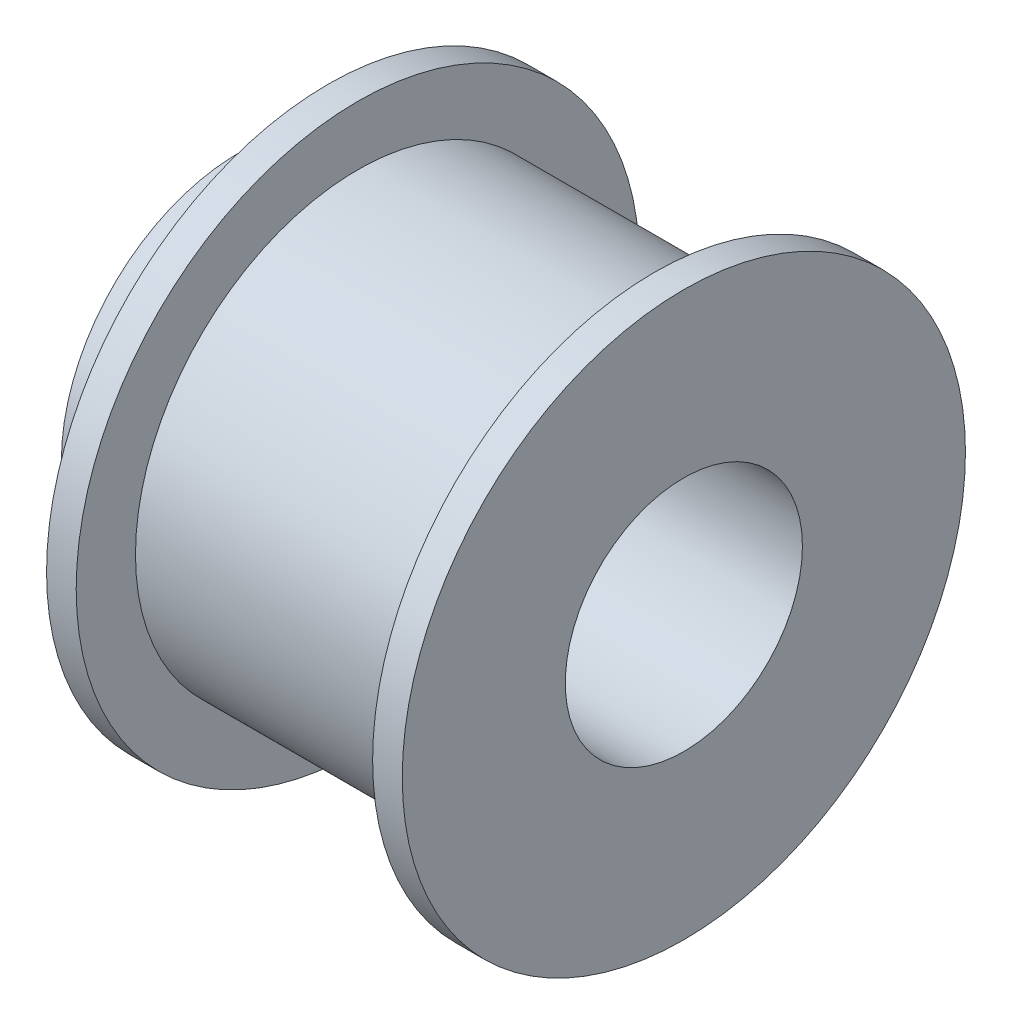
ISO-10303-21;
HEADER;
FILE_DESCRIPTION(('STEP AP214'),'2;1');
FILE_NAME('part.step','',(''),(''),'','','');
FILE_SCHEMA(('AUTOMOTIVE_DESIGN { 1 0 10303 214 1 1 1 1 }'));
ENDSEC;
DATA;
#1=APPLICATION_CONTEXT('core data for automotive mechanical design processes');
#2=APPLICATION_PROTOCOL_DEFINITION('international standard','automotive_design',2000,#1);
#3=PRODUCT_CONTEXT('',#1,'mechanical');
#4=PRODUCT('Part','Part','',(#3));
#5=PRODUCT_RELATED_PRODUCT_CATEGORY('part','',(#4));
#6=PRODUCT_DEFINITION_FORMATION('','',#4);
#7=PRODUCT_DEFINITION_CONTEXT('part definition',#1,'design');
#8=PRODUCT_DEFINITION('design','',#6,#7);
#9=PRODUCT_DEFINITION_SHAPE('','',#8);
#10=(LENGTH_UNIT() NAMED_UNIT(*) SI_UNIT(.MILLI.,.METRE.));
#11=(NAMED_UNIT(*) PLANE_ANGLE_UNIT() SI_UNIT($,.RADIAN.));
#12=(NAMED_UNIT(*) SI_UNIT($,.STERADIAN.) SOLID_ANGLE_UNIT());
#13=UNCERTAINTY_MEASURE_WITH_UNIT(LENGTH_MEASURE(1.E-05),#10,'distance_accuracy_value','');
#14=(GEOMETRIC_REPRESENTATION_CONTEXT(3) GLOBAL_UNCERTAINTY_ASSIGNED_CONTEXT((#13)) GLOBAL_UNIT_ASSIGNED_CONTEXT((#10,
#11,#12)) REPRESENTATION_CONTEXT('',''));
#15=CARTESIAN_POINT('',(0.,0.,0.));
#16=DIRECTION('',(0.,0.,1.));
#17=DIRECTION('',(1.,0.,0.));
#18=AXIS2_PLACEMENT_3D('',#15,#16,#17);
#19=CARTESIAN_POINT('',(1.5,3.30676167672102,5.00652845925889));
#20=DIRECTION('',(0.,0.55112694612017,0.834421409876482));
#21=DIRECTION('',(0.,-0.834421409876482,0.55112694612017));
#22=AXIS2_PLACEMENT_3D('',#19,#20,#21);
#23=CYLINDRICAL_SURFACE('',#22,0.799999999999996);
#24=CARTESIAN_POINT('',(1.5,2.60969929990767,5.40272797427942));
#25=CARTESIAN_POINT('',(1.45530659131064,2.6097028329292,5.40272693225995));
#26=CARTESIAN_POINT('',(1.41057791022667,2.613116824314,5.4010813624491));
#27=CARTESIAN_POINT('',(1.32232351564192,2.62666883867681,5.39450320826024));
#28=CARTESIAN_POINT('',(1.27880048886458,2.63682078956345,5.3895638151823));
#29=CARTESIAN_POINT('',(1.19431053037128,2.66347298022198,5.37644222033168));
#30=CARTESIAN_POINT('',(1.15334082529029,2.67996618750037,5.36826361056921));
#31=CARTESIAN_POINT('',(1.07506625904996,2.71871366034358,5.34874417623072));
#32=CARTESIAN_POINT('',(1.03775991380946,2.74096557957639,5.33740463939938));
#33=CARTESIAN_POINT('',(0.967611531261304,2.79062481136245,5.31160976320886));
#34=CARTESIAN_POINT('',(0.934796510928299,2.81806114559732,5.29713681351073));
#35=CARTESIAN_POINT('',(0.874794861558871,2.87710278231929,5.26530172290726));
#36=CARTESIAN_POINT('',(0.847608803805968,2.90870850742557,5.24793928907034));
#37=CARTESIAN_POINT('',(0.799543158809077,2.9752012770999,5.21053123252727));
#38=CARTESIAN_POINT('',(0.778687622088928,3.01010019102373,5.19047578458913));
#39=CARTESIAN_POINT('',(0.744029413089305,3.08197681253565,5.14812169201675));
#40=CARTESIAN_POINT('',(0.730226382943666,3.11895441453891,5.12582316127226));
#41=CARTESIAN_POINT('',(0.71014444500029,3.19362458722627,5.07963353728305));
#42=CARTESIAN_POINT('',(0.703821284818295,3.23131159905941,5.0557527022718));
#43=CARTESIAN_POINT('',(0.698741354498523,3.30649172625389,5.00690736749009));
#44=CARTESIAN_POINT('',(0.699984261160583,3.34398484982908,4.98194291405387));
#45=CARTESIAN_POINT('',(0.709965870026539,3.41747127373648,4.93182080909201));
#46=CARTESIAN_POINT('',(0.718656908222329,3.45347258825411,4.90666539206248));
#47=CARTESIAN_POINT('',(0.743213594389073,3.52326450487093,4.85679401194381));
#48=CARTESIAN_POINT('',(0.759079456717923,3.55705504088549,4.83207806200731));
#49=CARTESIAN_POINT('',(0.797586143568566,3.62167581819795,4.78383704157509));
#50=CARTESIAN_POINT('',(0.820247643529965,3.65249664065984,4.76031586522057));
#51=CARTESIAN_POINT('',(0.871685248801705,3.71033064147071,4.71537800989021));
#52=CARTESIAN_POINT('',(0.900461182562593,3.73734392661041,4.69396127189589));
#53=CARTESIAN_POINT('',(0.963571862766095,3.78715011748586,4.65387213868625));
#54=CARTESIAN_POINT('',(0.997947129929716,3.80990944605608,4.63522179905569));
#55=CARTESIAN_POINT('',(1.0711611561047,3.85046284243745,4.60159022696796));
#56=CARTESIAN_POINT('',(1.11000194259529,3.86825464217306,4.58661067089859));
#57=CARTESIAN_POINT('',(1.19109663060952,3.89849531020834,4.56093518478587));
#58=CARTESIAN_POINT('',(1.23335502263381,3.91093700874868,4.55024500428065));
#59=CARTESIAN_POINT('',(1.31996921947002,3.9301502388101,4.53366113734182));
#60=CARTESIAN_POINT('',(1.36432037160931,3.9369337752119,4.5277572965173));
#61=CARTESIAN_POINT('',(1.43925615490182,3.94345933648795,4.52207208183102));
#62=CARTESIAN_POINT('',(1.46961992861484,3.94477514982268,4.52092292969868));
#63=CARTESIAN_POINT('',(1.54469340868897,3.94477121054347,4.52092770095178));
#64=CARTESIAN_POINT('',(1.58942208977294,3.9419176534974,4.52342178382179));
#65=CARTESIAN_POINT('',(1.6776764843577,3.93054802203466,4.53330412596433));
#66=CARTESIAN_POINT('',(1.72119951113505,3.92202021839807,4.5407025228122));
#67=CARTESIAN_POINT('',(1.80568946962835,3.89949023769447,4.56006525732507));
#68=CARTESIAN_POINT('',(1.84665917470936,3.88549412473972,4.57202453682392));
#69=CARTESIAN_POINT('',(1.92493374094971,3.85233214984334,4.60000056923738));
#70=CARTESIAN_POINT('',(1.96224008619022,3.83316839327545,4.61601566958981));
#71=CARTESIAN_POINT('',(2.0323884687384,3.78995155309481,4.6515645045083));
#72=CARTESIAN_POINT('',(2.06520348907142,3.76587088093652,4.67111801922091));
#73=CARTESIAN_POINT('',(2.12520513844088,3.7134158238045,4.71292537314117));
#74=CARTESIAN_POINT('',(2.1523911961938,3.68504100352294,4.73517948606941));
#75=CARTESIAN_POINT('',(2.20045684119073,3.62453553789597,4.78165248621522));
#76=CARTESIAN_POINT('',(2.2213123779109,3.59239119691205,4.80587843362231));
#77=CARTESIAN_POINT('',(2.25597058691056,3.52522338338591,4.85536179146828));
#78=CARTESIAN_POINT('',(2.26977361705622,3.49020005703708,4.88061914949991));
#79=CARTESIAN_POINT('',(2.28985555499964,3.41840801593788,4.93116634416225));
#80=CARTESIAN_POINT('',(2.29617871518166,3.38165091808876,4.95645509461489));
#81=CARTESIAN_POINT('',(2.30125864550148,3.30721613585271,5.00642890223835));
#82=CARTESIAN_POINT('',(2.30001573883944,3.26953849085733,5.03111398515084));
#83=CARTESIAN_POINT('',(2.29003412997353,3.19459421592278,5.07902886341471));
#84=CARTESIAN_POINT('',(2.28134309177776,3.15732649543508,5.10226690684737));
#85=CARTESIAN_POINT('',(2.25678640561105,3.08406298450482,5.14688219734471));
#86=CARTESIAN_POINT('',(2.24092054328222,3.04806723209872,5.16825938879108));
#87=CARTESIAN_POINT('',(2.20241385643162,2.9783330012909,5.20875849947827));
#88=CARTESIAN_POINT('',(2.17975235647024,2.9446018015675,5.22787328432007));
#89=CARTESIAN_POINT('',(2.12831475119854,2.88056957100879,5.26342684871471));
#90=CARTESIAN_POINT('',(2.09953881743767,2.85026844397428,5.27986570332188));
#91=CARTESIAN_POINT('',(2.0364281372342,2.79384685902381,5.30993894728895));
#92=CARTESIAN_POINT('',(2.00205287007059,2.7677598662529,5.32355111146199));
#93=CARTESIAN_POINT('',(1.92883884389563,2.72090947603373,5.34764886105552));
#94=CARTESIAN_POINT('',(1.88999805740505,2.7001485106944,5.35813301843926));
#95=CARTESIAN_POINT('',(1.80890336939084,2.66466361812381,5.37586860384268));
#96=CARTESIAN_POINT('',(1.76664497736656,2.64994779325806,5.38311569431568));
#97=CARTESIAN_POINT('',(1.68003078053036,2.62715333498405,5.39427748288358));
#98=CARTESIAN_POINT('',(1.63567962839107,2.61906064999926,5.39819923661542));
#99=CARTESIAN_POINT('',(1.56074384509831,2.61127030507374,5.40196953394311));
#100=CARTESIAN_POINT('',(1.53038007138504,2.60969689835789,5.40272868258579));
#101=CARTESIAN_POINT('',(1.5,2.60969929990767,5.40272797427942));
#102=B_SPLINE_CURVE_WITH_KNOTS('',3,(#24,#25,#26,#27,#28,#29,#30,#31,#32,#33,#34,#35,#36,#37,
#38,#39,#40,#41,#42,#43,#44,#45,#46,#47,#48,#49,#50,#51,#52,#53,#54,#55,#56,#57,#58,#59,#60,#61,
#62,#63,#64,#65,#66,#67,#68,#69,#70,#71,#72,#73,#74,#75,#76,#77,#78,#79,#80,#81,#82,#83,#84,#85,
#86,#87,#88,#89,#90,#91,#92,#93,#94,#95,#96,#97,#98,#99,#100,#101),.UNSPECIFIED.,.T.,.F.,(4,2,2,
2,2,2,2,2,2,2,2,2,2,2,2,2,2,2,2,2,2,2,2,2,2,2,2,2,2,2,2,2,2,2,2,2,2,2,4),(0.,0.13398245990863,
0.26824273858272,0.402354549249688,0.53641180313671,0.671243002322139,0.806087878828395,
0.941438816229276,1.07678288481946,1.21132216157637,1.34585569125067,1.47953465380474,
1.61321761046851,1.74731149112173,1.8814016100701,2.01650913425629,2.15167824536653,
2.28702793855821,2.42208972552405,2.51316348372905,2.64714594363768,2.78140622231177,
2.91551803297873,3.04957528686575,3.18440648605118,3.31925136255744,3.45460229995832,
3.5899463685485,3.72448564530541,3.85901917497971,3.99269813753378,4.12638109419755,
4.26047497485077,4.39456509379914,4.52967261798533,4.66484172909557,4.80019142228725,
4.93525320925309,5.02632696745887),.UNSPECIFIED.);
#103=CARTESIAN_POINT('',(1.5,2.60969929990767,5.40272797427942));
#104=VERTEX_POINT('',#103);
#105=EDGE_CURVE('E19',#104,#104,#102,.T.);
#106=ORIENTED_EDGE('',*,*,#105,.F.);
#107=EDGE_LOOP('',(#106));
#108=FACE_BOUND('',#107,.T.);
#109=CARTESIAN_POINT('',(1.5,1.49243055448725,3.71115225233793));
#110=CARTESIAN_POINT('',(1.45557927656787,1.49243398061672,3.71115170611891));
#111=CARTESIAN_POINT('',(1.41113032220663,1.49595001033545,3.70974293353468));
#112=CARTESIAN_POINT('',(1.32344014617124,1.50988641751702,3.70409192831212));
#113=CARTESIAN_POINT('',(1.28020149838485,1.52032049322246,3.69984407394744));
#114=CARTESIAN_POINT('',(1.1962847365091,1.54765211916368,3.68849430852175));
#115=CARTESIAN_POINT('',(1.15560300386399,1.56454028424717,3.68139654087934));
#116=CARTESIAN_POINT('',(1.0778499712256,1.60412210634923,3.66432184848555));
#117=CARTESIAN_POINT('',(1.04077749643031,1.6268138655347,3.65434586480318));
#118=CARTESIAN_POINT('',(0.970752163143968,1.67751331587381,3.63135396085115));
#119=CARTESIAN_POINT('',(0.937858088260901,1.70558531311378,3.61830077563453));
#120=CARTESIAN_POINT('',(0.877635421131798,1.76588213449797,3.58925871152869));
#121=CARTESIAN_POINT('',(0.850307514682451,1.79810746956914,3.57326947135483));
#122=CARTESIAN_POINT('',(0.80176948339739,1.86593667412084,3.53832532745209));
#123=CARTESIAN_POINT('',(0.780614610010396,1.90156747989155,3.51934584967428));
#124=CARTESIAN_POINT('',(0.74537993066051,1.97479247806482,3.47878486339613));
#125=CARTESIAN_POINT('',(0.731299402725784,2.01238646968212,3.45720362069757));
#126=CARTESIAN_POINT('',(0.710794253158571,2.08782361505902,3.41216881212805));
#127=CARTESIAN_POINT('',(0.704271227955003,2.1256569637329,3.38874365387186));
#128=CARTESIAN_POINT('',(0.698759237080274,2.20089345539583,3.3403693241451));
#129=CARTESIAN_POINT('',(0.699769557073391,2.23829663883766,3.31542029739509));
#130=CARTESIAN_POINT('',(0.709220926007679,2.31106376026074,3.26510554227687));
#131=CARTESIAN_POINT('',(0.71755591711064,2.34644915771148,3.23975081279627));
#132=CARTESIAN_POINT('',(0.741251911181273,2.41483183353086,3.18910626468926));
#133=CARTESIAN_POINT('',(0.756613248270219,2.44782899824632,3.16381644920719));
#134=CARTESIAN_POINT('',(0.794024715601151,2.51086758578164,3.11402778853381));
#135=CARTESIAN_POINT('',(0.816116603234787,2.54088895953388,3.08953496913946));
#136=CARTESIAN_POINT('',(0.866329356186967,2.59711485147093,3.0424236771083));
#137=CARTESIAN_POINT('',(0.894450473125368,2.62331921028229,3.01980528275216));
#138=CARTESIAN_POINT('',(0.956500150380005,2.67184078068297,2.97696726937488));
#139=CARTESIAN_POINT('',(0.990520526023223,2.6940831368745,2.95679576271539));
#140=CARTESIAN_POINT('',(1.06311702361781,2.73372387923708,2.92018569023181));
#141=CARTESIAN_POINT('',(1.10169516106894,2.75112011088635,2.9037487853583));
#142=CARTESIAN_POINT('',(1.18245573775745,2.7807915015449,2.87534750433173));
#143=CARTESIAN_POINT('',(1.22464838757506,2.79305153558372,2.8633963483266));
#144=CARTESIAN_POINT('',(1.31127047455549,2.81212986314412,2.84466299552952));
#145=CARTESIAN_POINT('',(1.35569498323665,2.81895963105223,2.83786990090651));
#146=CARTESIAN_POINT('',(1.43355135243057,2.82601098048321,2.83084356209977));
#147=CARTESIAN_POINT('',(1.46676777593069,2.82750619222483,2.8293469414826));
#148=CARTESIAN_POINT('',(1.54442072343213,2.82750296308976,2.82935207530767));
#149=CARTESIAN_POINT('',(1.58886967779338,2.82482714702951,2.83203295456433));
#150=CARTESIAN_POINT('',(1.67655985382876,2.81415937432534,2.84263276261392));
#151=CARTESIAN_POINT('',(1.71979850161515,2.80615687032173,2.85056208365689));
#152=CARTESIAN_POINT('',(1.8037152634909,2.78498982883842,2.87124520012063));
#153=CARTESIAN_POINT('',(1.84439699613601,2.77183278608703,2.8839919899687));
#154=CARTESIAN_POINT('',(1.92215002877439,2.74059185127785,2.91369501596792));
#155=CARTESIAN_POINT('',(1.95922250356969,2.72250956969686,2.93064987598469));
#156=CARTESIAN_POINT('',(2.02924783685603,2.68146244241479,2.96825566349029));
#157=CARTESIAN_POINT('',(2.0621419117391,2.65843808118525,2.98895110896296));
#158=CARTESIAN_POINT('',(2.1223645788682,2.60805921130826,3.0330092254284));
#159=CARTESIAN_POINT('',(2.14969248531755,2.58070416982323,3.0563722245325));
#160=CARTESIAN_POINT('',(2.19823051660261,2.52194029868803,3.10504153346963));
#161=CARTESIAN_POINT('',(2.2193853899896,2.49049829421419,3.13036297203965));
#162=CARTESIAN_POINT('',(2.25462006933949,2.42445041753497,3.18179031837893));
#163=CARTESIAN_POINT('',(2.26870059727422,2.38984486861114,3.20789614580914));
#164=CARTESIAN_POINT('',(2.28920574684143,2.31881391162723,3.2596020452352));
#165=CARTESIAN_POINT('',(2.295728772045,2.2824184799818,3.28520424956509));
#166=CARTESIAN_POINT('',(2.30124076291973,2.20839477785676,3.33541477613037));
#167=CARTESIAN_POINT('',(2.30023044292661,2.17076662460459,3.36002319237741));
#168=CARTESIAN_POINT('',(2.29077907399232,2.09592750009803,3.40720087763114));
#169=CARTESIAN_POINT('',(2.28244408288936,2.05871822177537,3.42979420112476));
#170=CARTESIAN_POINT('',(2.25874808881873,1.98529674666693,3.47280986801582));
#171=CARTESIAN_POINT('',(2.24338675172978,1.94908459738408,3.49323210811559));
#172=CARTESIAN_POINT('',(2.20597528439885,1.87854797161774,3.53166853192943));
#173=CARTESIAN_POINT('',(2.18388339676521,1.84423690694983,3.54966664086373));
#174=CARTESIAN_POINT('',(2.13367064381303,1.77883688245581,3.5828880429585));
#175=CARTESIAN_POINT('',(2.10554952687463,1.74774805718484,3.59811122026273));
#176=CARTESIAN_POINT('',(2.04349984961999,1.6893024424039,3.62592395650241));
#177=CARTESIAN_POINT('',(2.00947947397678,1.66201928606615,3.63846355259296));
#178=CARTESIAN_POINT('',(1.93688297638219,1.61278767053689,3.66055277835327));
#179=CARTESIAN_POINT('',(1.89830483893106,1.59084158468411,3.67010107836731));
#180=CARTESIAN_POINT('',(1.81754426224255,1.55307310964257,3.68624315012401));
#181=CARTESIAN_POINT('',(1.77535161242494,1.53726881643466,3.6928281999105));
#182=CARTESIAN_POINT('',(1.68872952544451,1.51255033259295,3.70302220040535));
#183=CARTESIAN_POINT('',(1.64430501676335,1.50362161483643,3.70663742701792));
#184=CARTESIAN_POINT('',(1.56644864756943,1.49439139730806,3.71036489937916));
#185=CARTESIAN_POINT('',(1.53323222406931,1.49242799131643,3.71115266097766));
#186=CARTESIAN_POINT('',(1.5,1.49243055448725,3.71115225233793));
#187=B_SPLINE_CURVE_WITH_KNOTS('',3,(#109,#110,#111,#112,#113,#114,#115,#116,#117,#118,#119,
#120,#121,#122,#123,#124,#125,#126,#127,#128,#129,#130,#131,#132,#133,#134,#135,#136,#137,#138,
#139,#140,#141,#142,#143,#144,#145,#146,#147,#148,#149,#150,#151,#152,#153,#154,#155,#156,#157,
#158,#159,#160,#161,#162,#163,#164,#165,#166,#167,#168,#169,#170,#171,#172,#173,#174,#175,#176,
#177,#178,#179,#180,#181,#182,#183,#184,#185,#186),.UNSPECIFIED.,.T.,.F.,(4,2,2,2,2,2,2,2,2,2,2,
2,2,2,2,2,2,2,2,2,2,2,2,2,2,2,2,2,2,2,2,2,2,2,2,2,2,2,4),(0.,0.133151875968845,
0.266568193029765,0.399791237712026,0.532970772709303,0.667854442531857,0.802754721067218,
0.938827778799764,1.07488694678359,1.20915388798976,1.34340809773998,1.47574981865371,
1.60809783341951,1.74128428043316,1.87447628684393,2.00996598528992,2.14551582484685,
2.28146206975591,2.41712028523402,2.51673444357179,2.64988631954063,2.78330263660155,
2.91652568128381,3.04970521628109,3.18458888610364,3.319489164639,3.45556222237155,
3.59162139035537,3.72588833156155,3.86014254131177,3.99248426222549,4.12483227699129,
4.25801872400494,4.39121073041572,4.52670042886171,4.66225026841863,4.7981965133277,
4.93385472880581,5.03346888714357),.UNSPECIFIED.);
#188=CARTESIAN_POINT('',(1.5,1.49243055448725,3.71115225233793));
#189=VERTEX_POINT('',#188);
#190=EDGE_CURVE('E60',#189,#189,#187,.T.);
#191=ORIENTED_EDGE('',*,*,#190,.T.);
#192=EDGE_LOOP('',(#191));
#193=FACE_BOUND('',#192,.T.);
#194=ADVANCED_FACE('F15',(#108,#193),#23,.F.);
#195=CARTESIAN_POINT('',(1.5,3.30676167672102,5.00652845925889));
#196=DIRECTION('',(0.,0.55112694612017,0.834421409876482));
#197=DIRECTION('',(0.,-0.834421409876482,0.55112694612017));
#198=AXIS2_PLACEMENT_3D('',#195,#196,#197);
#199=CYLINDRICAL_SURFACE('',#198,0.799999999999996);
#200=CARTESIAN_POINT('',(1.5,-3.94477355571004,-4.52092486048715));
#201=CARTESIAN_POINT('',(1.54469340868936,-3.94477121054345,-4.52092770095179));
#202=CARTESIAN_POINT('',(1.58942208977333,-3.94191765349737,-4.52342178382181));
#203=CARTESIAN_POINT('',(1.67767648435808,-3.93054802203459,-4.53330412596439));
#204=CARTESIAN_POINT('',(1.72119951113542,-3.92202021839799,-4.54070252281227));
#205=CARTESIAN_POINT('',(1.80568946962871,-3.89949023769436,-4.56006525732516));
#206=CARTESIAN_POINT('',(1.84665917470971,-3.88549412473959,-4.57202453682402));
#207=CARTESIAN_POINT('',(1.92493374095004,-3.85233214984319,-4.60000056923751));
#208=CARTESIAN_POINT('',(1.96224008619054,-3.83316839327528,-4.61601566958996));
#209=CARTESIAN_POINT('',(2.0323884687387,-3.78995155309461,-4.65156450450847));
#210=CARTESIAN_POINT('',(2.0652034890717,-3.76587088093631,-4.67111801922108));
#211=CARTESIAN_POINT('',(2.12520513844113,-3.71341582380427,-4.71292537314136));
#212=CARTESIAN_POINT('',(2.15239119619403,-3.68504100352269,-4.73517948606961));
#213=CARTESIAN_POINT('',(2.20045684119092,-3.6245355378957,-4.78165248621543));
#214=CARTESIAN_POINT('',(2.22131237791107,-3.59239119691177,-4.80587843362252));
#215=CARTESIAN_POINT('',(2.25597058691069,-3.52522338338561,-4.85536179146849));
#216=CARTESIAN_POINT('',(2.26977361705633,-3.49020005703678,-4.88061914950013));
#217=CARTESIAN_POINT('',(2.28985555499971,-3.41840801593756,-4.93116634416247));
#218=CARTESIAN_POINT('',(2.2961787151817,-3.38165091808844,-4.95645509461511));
#219=CARTESIAN_POINT('',(2.30125864550148,-3.30721613585239,-5.00642890223856));
#220=CARTESIAN_POINT('',(2.30001573883942,-3.26953849085701,-5.03111398515105));
#221=CARTESIAN_POINT('',(2.29003412997346,-3.19459421592246,-5.07902886341492));
#222=CARTESIAN_POINT('',(2.28134309177767,-3.15732649543476,-5.10226690684757));
#223=CARTESIAN_POINT('',(2.25678640561093,-3.08406298450451,-5.1468821973449));
#224=CARTESIAN_POINT('',(2.24092054328208,-3.04806723209842,-5.16825938879126));
#225=CARTESIAN_POINT('',(2.20241385643143,-2.97833300129061,-5.20875849947844));
#226=CARTESIAN_POINT('',(2.17975235647003,-2.94460180156722,-5.22787328432023));
#227=CARTESIAN_POINT('',(2.12831475119829,-2.88056957100852,-5.26342684871486));
#228=CARTESIAN_POINT('',(2.09953881743741,-2.85026844397402,-5.27986570332201));
#229=CARTESIAN_POINT('',(2.0364281372339,-2.79384685902358,-5.30993894728907));
#230=CARTESIAN_POINT('',(2.00205287007028,-2.76775986625269,-5.3235511114621));
#231=CARTESIAN_POINT('',(1.9288388438953,-2.72090947603355,-5.34764886105561));
#232=CARTESIAN_POINT('',(1.88999805740471,-2.70014851069423,-5.35813301843935));
#233=CARTESIAN_POINT('',(1.80890336939048,-2.66466361812368,-5.37586860384274));
#234=CARTESIAN_POINT('',(1.76664497736619,-2.64994779325794,-5.38311569431574));
#235=CARTESIAN_POINT('',(1.68003078052998,-2.62715333498397,-5.39427748288362));
#236=CARTESIAN_POINT('',(1.63567962839069,-2.6190606499992,-5.39819923661545));
#237=CARTESIAN_POINT('',(1.56074384509818,-2.61127030507375,-5.40196953394311));
#238=CARTESIAN_POINT('',(1.53038007138516,-2.6096968983579,-5.40272868258578));
#239=CARTESIAN_POINT('',(1.45530659131102,-2.60970283292919,-5.40272693225995));
#240=CARTESIAN_POINT('',(1.41057791022706,-2.61311682431396,-5.40108136244912));
#241=CARTESIAN_POINT('',(1.32232351564229,-2.62666883867673,-5.39450320826028));
#242=CARTESIAN_POINT('',(1.27880048886495,-2.63682078956336,-5.38956381518234));
#243=CARTESIAN_POINT('',(1.19431053037165,-2.66347298022185,-5.37644222033175));
#244=CARTESIAN_POINT('',(1.15334082529064,-2.67996618750022,-5.36826361056928));
#245=CARTESIAN_POINT('',(1.07506625905029,-2.7187136603434,-5.34874417623081));
#246=CARTESIAN_POINT('',(1.03775991380978,-2.7409655795762,-5.33740463939949));
#247=CARTESIAN_POINT('',(0.967611531261597,-2.79062481136222,-5.31160976320898));
#248=CARTESIAN_POINT('',(0.934796510928578,-2.81806114559708,-5.29713681351086));
#249=CARTESIAN_POINT('',(0.874794861559118,-2.87710278231902,-5.2653017229074));
#250=CARTESIAN_POINT('',(0.847608803806197,-2.90870850742529,-5.24793928907049));
#251=CARTESIAN_POINT('',(0.799543158809269,-2.9752012770996,-5.21053123252744));
#252=CARTESIAN_POINT('',(0.7786876220891,-3.01010019102342,-5.19047578458931));
#253=CARTESIAN_POINT('',(0.744029413089436,-3.08197681253533,-5.14812169201694));
#254=CARTESIAN_POINT('',(0.730226382943776,-3.11895441453859,-5.12582316127245));
#255=CARTESIAN_POINT('',(0.710144445000356,-3.19362458722594,-5.07963353728325));
#256=CARTESIAN_POINT('',(0.703821284818339,-3.23131159905908,-5.05575270227201));
#257=CARTESIAN_POINT('',(0.698741354498523,-3.30649172625356,-5.00690736749031));
#258=CARTESIAN_POINT('',(0.699984261160561,-3.34398484982876,-4.98194291405409));
#259=CARTESIAN_POINT('',(0.709965870026474,-3.41747127373617,-4.93182080909223));
#260=CARTESIAN_POINT('',(0.718656908222242,-3.45347258825381,-4.9066653920627));
#261=CARTESIAN_POINT('',(0.743213594388944,-3.52326450487063,-4.85679401194403));
#262=CARTESIAN_POINT('',(0.759079456717774,-3.5570550408852,-4.83207806200752));
#263=CARTESIAN_POINT('',(0.797586143568379,-3.62167581819768,-4.78383704157529));
#264=CARTESIAN_POINT('',(0.820247643529758,-3.65249664065958,-4.76031586522077));
#265=CARTESIAN_POINT('',(0.871685248801462,-3.71033064147047,-4.7153780098904));
#266=CARTESIAN_POINT('',(0.900461182562333,-3.73734392661018,-4.69396127189607));
#267=CARTESIAN_POINT('',(0.963571862765803,-3.78715011748566,-4.65387213868641));
#268=CARTESIAN_POINT('',(0.997947129929408,-3.80990944605589,-4.63522179905585));
#269=CARTESIAN_POINT('',(1.07116115610437,-3.85046284243729,-4.6015902269681));
#270=CARTESIAN_POINT('',(1.11000194259494,-3.86825464217291,-4.58661067089871));
#271=CARTESIAN_POINT('',(1.19109663060916,-3.89849531020822,-4.56093518478596));
#272=CARTESIAN_POINT('',(1.23335502263343,-3.91093700874858,-4.55024500428074));
#273=CARTESIAN_POINT('',(1.31996921946964,-3.93015023881004,-4.53366113734188));
#274=CARTESIAN_POINT('',(1.36432037160892,-3.93693377521185,-4.52775729651734));
#275=CARTESIAN_POINT('',(1.43925615490169,-3.94345933648795,-4.52207208183102));
#276=CARTESIAN_POINT('',(1.46961992861496,-3.9447751498227,-4.52092292969867));
#277=CARTESIAN_POINT('',(1.5,-3.94477355571004,-4.52092486048715));
#278=B_SPLINE_CURVE_WITH_KNOTS('',3,(#200,#201,#202,#203,#204,#205,#206,#207,#208,#209,#210,
#211,#212,#213,#214,#215,#216,#217,#218,#219,#220,#221,#222,#223,#224,#225,#226,#227,#228,#229,
#230,#231,#232,#233,#234,#235,#236,#237,#238,#239,#240,#241,#242,#243,#244,#245,#246,#247,#248,
#249,#250,#251,#252,#253,#254,#255,#256,#257,#258,#259,#260,#261,#262,#263,#264,#265,#266,#267,
#268,#269,#270,#271,#272,#273,#274,#275,#276,#277),.UNSPECIFIED.,.T.,.F.,(4,2,2,2,2,2,2,2,2,2,2,
2,2,2,2,2,2,2,2,2,2,2,2,2,2,2,2,2,2,2,2,2,2,2,2,2,2,2,4),(0.,0.133982459908629,
0.268242738582719,0.402354549249687,0.536411803136708,0.671243002322138,0.806087878828394,
0.941438816229275,1.07678288481946,1.21132216157636,1.34585569125067,1.47953465380474,
1.61321761046851,1.74731149112173,1.8814016100701,2.01650913425629,2.15167824536653,
2.28702793855821,2.42208972552405,2.51316348372905,2.64714594363768,2.78140622231177,
2.91551803297873,3.04957528686575,3.18440648605118,3.31925136255743,3.45460229995832,
3.5899463685485,3.72448564530541,3.85901917497971,3.99269813753378,4.12638109419755,
4.26047497485077,4.39456509379914,4.52967261798533,4.66484172909557,4.80019142228725,
4.93525320925309,5.02632696745887),.UNSPECIFIED.);
#279=CARTESIAN_POINT('',(1.5,-3.94477355571004,-4.52092486048715));
#280=VERTEX_POINT('',#279);
#281=EDGE_CURVE('E81',#280,#280,#278,.T.);
#282=ORIENTED_EDGE('',*,*,#281,.F.);
#283=EDGE_LOOP('',(#282));
#284=FACE_BOUND('',#283,.T.);
#285=CARTESIAN_POINT('',(1.5,-2.82750481028962,-2.82934913854566));
#286=CARTESIAN_POINT('',(1.54442072343213,-2.82750296308973,-2.82935207530763));
#287=CARTESIAN_POINT('',(1.58886967779337,-2.82482714702951,-2.83203295456431));
#288=CARTESIAN_POINT('',(1.67655985382876,-2.81415937432535,-2.84263276261393));
#289=CARTESIAN_POINT('',(1.71979850161515,-2.80615687032174,-2.85056208365689));
#290=CARTESIAN_POINT('',(1.8037152634909,-2.78498982883842,-2.87124520012063));
#291=CARTESIAN_POINT('',(1.84439699613601,-2.77183278608703,-2.8839919899687));
#292=CARTESIAN_POINT('',(1.9221500287744,-2.74059185127785,-2.91369501596792));
#293=CARTESIAN_POINT('',(1.9592225035697,-2.72250956969686,-2.93064987598469));
#294=CARTESIAN_POINT('',(2.02924783685603,-2.68146244241479,-2.96825566349029));
#295=CARTESIAN_POINT('',(2.0621419117391,-2.65843808118526,-2.98895110896296));
#296=CARTESIAN_POINT('',(2.1223645788682,-2.60805921130827,-3.0330092254284));
#297=CARTESIAN_POINT('',(2.14969248531755,-2.58070416982323,-3.0563722245325));
#298=CARTESIAN_POINT('',(2.19823051660261,-2.52194029868803,-3.10504153346963));
#299=CARTESIAN_POINT('',(2.2193853899896,-2.49049829421419,-3.13036297203965));
#300=CARTESIAN_POINT('',(2.25462006933949,-2.42445041753498,-3.18179031837893));
#301=CARTESIAN_POINT('',(2.26870059727422,-2.38984486861114,-3.20789614580913));
#302=CARTESIAN_POINT('',(2.28920574684143,-2.31881391162723,-3.25960204523519));
#303=CARTESIAN_POINT('',(2.295728772045,-2.2824184799818,-3.28520424956509));
#304=CARTESIAN_POINT('',(2.30124076291973,-2.20839477785676,-3.33541477613037));
#305=CARTESIAN_POINT('',(2.30023044292661,-2.17076662460459,-3.36002319237741));
#306=CARTESIAN_POINT('',(2.29077907399232,-2.09592750009804,-3.40720087763114));
#307=CARTESIAN_POINT('',(2.28244408288936,-2.05871822177538,-3.42979420112476));
#308=CARTESIAN_POINT('',(2.25874808881873,-1.98529674666693,-3.47280986801582));
#309=CARTESIAN_POINT('',(2.24338675172978,-1.94908459738408,-3.49323210811559));
#310=CARTESIAN_POINT('',(2.20597528439885,-1.87854797161774,-3.53166853192943));
#311=CARTESIAN_POINT('',(2.18388339676521,-1.84423690694984,-3.54966664086373));
#312=CARTESIAN_POINT('',(2.13367064381303,-1.77883688245581,-3.58288804295849));
#313=CARTESIAN_POINT('',(2.10554952687463,-1.74774805718484,-3.59811122026273));
#314=CARTESIAN_POINT('',(2.04349984961999,-1.68930244240391,-3.62592395650241));
#315=CARTESIAN_POINT('',(2.00947947397677,-1.66201928606615,-3.63846355259296));
#316=CARTESIAN_POINT('',(1.93688297638219,-1.61278767053689,-3.66055277835327));
#317=CARTESIAN_POINT('',(1.89830483893106,-1.59084158468412,-3.67010107836731));
#318=CARTESIAN_POINT('',(1.81754426224255,-1.55307310964257,-3.68624315012401));
#319=CARTESIAN_POINT('',(1.77535161242494,-1.53726881643467,-3.6928281999105));
#320=CARTESIAN_POINT('',(1.68872952544451,-1.51255033259295,-3.70302220040535));
#321=CARTESIAN_POINT('',(1.64430501676335,-1.50362161483643,-3.7066374270179));
#322=CARTESIAN_POINT('',(1.56644864756943,-1.49439139730807,-3.71036489937917));
#323=CARTESIAN_POINT('',(1.53323222406931,-1.49242799131645,-3.7111526609777));
#324=CARTESIAN_POINT('',(1.45557927656787,-1.49243398061675,-3.71115170611896));
#325=CARTESIAN_POINT('',(1.41113032220662,-1.49595001033546,-3.70974293353469));
#326=CARTESIAN_POINT('',(1.32344014617124,-1.50988641751702,-3.7040919283121));
#327=CARTESIAN_POINT('',(1.28020149838485,-1.52032049322247,-3.69984407394744));
#328=CARTESIAN_POINT('',(1.1962847365091,-1.54765211916369,-3.68849430852175));
#329=CARTESIAN_POINT('',(1.15560300386399,-1.56454028424717,-3.68139654087934));
#330=CARTESIAN_POINT('',(1.0778499712256,-1.60412210634923,-3.66432184848555));
#331=CARTESIAN_POINT('',(1.04077749643031,-1.6268138655347,-3.65434586480317));
#332=CARTESIAN_POINT('',(0.970752163143968,-1.67751331587382,-3.63135396085115));
#333=CARTESIAN_POINT('',(0.937858088260902,-1.70558531311378,-3.61830077563453));
#334=CARTESIAN_POINT('',(0.877635421131798,-1.76588213449798,-3.58925871152869));
#335=CARTESIAN_POINT('',(0.850307514682451,-1.79810746956914,-3.57326947135483));
#336=CARTESIAN_POINT('',(0.80176948339739,-1.86593667412084,-3.53832532745209));
#337=CARTESIAN_POINT('',(0.780614610010396,-1.90156747989155,-3.51934584967428));
#338=CARTESIAN_POINT('',(0.745379930660511,-1.97479247806482,-3.47878486339612));
#339=CARTESIAN_POINT('',(0.731299402725784,-2.01238646968213,-3.45720362069757));
#340=CARTESIAN_POINT('',(0.710794253158571,-2.08782361505902,-3.41216881212805));
#341=CARTESIAN_POINT('',(0.704271227955003,-2.1256569637329,-3.38874365387186));
#342=CARTESIAN_POINT('',(0.698759237080274,-2.20089345539583,-3.3403693241451));
#343=CARTESIAN_POINT('',(0.699769557073391,-2.23829663883766,-3.31542029739509));
#344=CARTESIAN_POINT('',(0.709220926007679,-2.31106376026074,-3.26510554227686));
#345=CARTESIAN_POINT('',(0.71755591711064,-2.34644915771148,-3.23975081279627));
#346=CARTESIAN_POINT('',(0.741251911181273,-2.41483183353087,-3.18910626468926));
#347=CARTESIAN_POINT('',(0.756613248270219,-2.44782899824632,-3.16381644920719));
#348=CARTESIAN_POINT('',(0.79402471560115,-2.51086758578164,-3.11402778853381));
#349=CARTESIAN_POINT('',(0.816116603234786,-2.54088895953388,-3.08953496913945));
#350=CARTESIAN_POINT('',(0.866329356186967,-2.59711485147093,-3.0424236771083));
#351=CARTESIAN_POINT('',(0.894450473125368,-2.62331921028229,-3.01980528275215));
#352=CARTESIAN_POINT('',(0.956500150380005,-2.67184078068297,-2.97696726937488));
#353=CARTESIAN_POINT('',(0.990520526023223,-2.6940831368745,-2.95679576271539));
#354=CARTESIAN_POINT('',(1.06311702361781,-2.73372387923709,-2.9201856902318));
#355=CARTESIAN_POINT('',(1.10169516106894,-2.75112011088635,-2.9037487853583));
#356=CARTESIAN_POINT('',(1.18245573775745,-2.7807915015449,-2.87534750433173));
#357=CARTESIAN_POINT('',(1.22464838757505,-2.79305153558371,-2.8633963483266));
#358=CARTESIAN_POINT('',(1.31127047455549,-2.81212986314412,-2.84466299552952));
#359=CARTESIAN_POINT('',(1.35569498323665,-2.81895963105224,-2.83786990090652));
#360=CARTESIAN_POINT('',(1.43355135243057,-2.8260109804832,-2.83084356209976));
#361=CARTESIAN_POINT('',(1.46676777593069,-2.82750619222481,-2.82934694148256));
#362=CARTESIAN_POINT('',(1.5,-2.82750481028962,-2.82934913854566));
#363=B_SPLINE_CURVE_WITH_KNOTS('',3,(#285,#286,#287,#288,#289,#290,#291,#292,#293,#294,#295,
#296,#297,#298,#299,#300,#301,#302,#303,#304,#305,#306,#307,#308,#309,#310,#311,#312,#313,#314,
#315,#316,#317,#318,#319,#320,#321,#322,#323,#324,#325,#326,#327,#328,#329,#330,#331,#332,#333,
#334,#335,#336,#337,#338,#339,#340,#341,#342,#343,#344,#345,#346,#347,#348,#349,#350,#351,#352,
#353,#354,#355,#356,#357,#358,#359,#360,#361,#362),.UNSPECIFIED.,.T.,.F.,(4,2,2,2,2,2,2,2,2,2,2,
2,2,2,2,2,2,2,2,2,2,2,2,2,2,2,2,2,2,2,2,2,2,2,2,2,2,2,4),(0.,0.133151875968845,
0.266568193029766,0.399791237712027,0.532970772709304,0.667854442531859,0.802754721067219,
0.938827778799766,1.07488694678359,1.20915388798977,1.34340809773998,1.47574981865371,
1.60809783341951,1.74128428043316,1.87447628684394,2.00996598528993,2.14551582484685,
2.28146206975591,2.41712028523402,2.51673444357179,2.64988631954063,2.78330263660155,
2.91652568128381,3.04970521628109,3.18458888610364,3.319489164639,3.45556222237155,
3.59162139035537,3.72588833156155,3.86014254131177,3.99248426222549,4.12483227699129,
4.25801872400494,4.39121073041572,4.52670042886171,4.66225026841863,4.7981965133277,
4.93385472880581,5.03346888714357),.UNSPECIFIED.);
#364=CARTESIAN_POINT('',(1.5,-2.82750481028962,-2.82934913854566));
#365=VERTEX_POINT('',#364);
#366=EDGE_CURVE('E54',#365,#365,#363,.T.);
#367=ORIENTED_EDGE('',*,*,#366,.T.);
#368=EDGE_LOOP('',(#367));
#369=FACE_BOUND('',#368,.T.);
#370=ADVANCED_FACE('F64',(#284,#369),#199,.F.);
#371=CARTESIAN_POINT('',(0.,4.,0.));
#372=DIRECTION('',(-1.,0.,0.));
#373=DIRECTION('',(0.,0.,1.));
#374=AXIS2_PLACEMENT_3D('',#371,#372,#373);
#375=PLANE('',#374);
#376=CARTESIAN_POINT('',(0.,0.,0.));
#377=DIRECTION('',(1.,0.,0.));
#378=DIRECTION('',(0.,0.,-1.));
#379=AXIS2_PLACEMENT_3D('',#376,#377,#378);
#380=CIRCLE('',#379,6.);
#381=CARTESIAN_POINT('',(0.,0.,-6.));
#382=VERTEX_POINT('',#381);
#383=EDGE_CURVE('E85',#382,#382,#380,.T.);
#384=ORIENTED_EDGE('',*,*,#383,.F.);
#385=EDGE_LOOP('',(#384));
#386=FACE_BOUND('',#385,.T.);
#387=CARTESIAN_POINT('',(0.,0.,0.));
#388=DIRECTION('',(1.,0.,0.));
#389=DIRECTION('',(0.,0.,-1.));
#390=AXIS2_PLACEMENT_3D('',#387,#388,#389);
#391=CIRCLE('',#390,4.);
#392=CARTESIAN_POINT('',(0.,0.,-4.));
#393=VERTEX_POINT('',#392);
#394=EDGE_CURVE('E51',#393,#393,#391,.T.);
#395=ORIENTED_EDGE('',*,*,#394,.T.);
#396=EDGE_LOOP('',(#395));
#397=FACE_BOUND('',#396,.T.);
#398=ADVANCED_FACE('F78',(#386,#397),#375,.T.);
#399=CARTESIAN_POINT('',(15.,0.,0.));
#400=DIRECTION('',(1.,0.,0.));
#401=DIRECTION('',(0.,0.,-1.));
#402=AXIS2_PLACEMENT_3D('',#399,#400,#401);
#403=CYLINDRICAL_SURFACE('',#402,6.);
#404=ORIENTED_EDGE('',*,*,#383,.T.);
#405=EDGE_LOOP('',(#404));
#406=FACE_BOUND('',#405,.T.);
#407=ORIENTED_EDGE('',*,*,#281,.T.);
#408=EDGE_LOOP('',(#407));
#409=FACE_BOUND('',#408,.T.);
#410=CARTESIAN_POINT('',(3.,0.,0.));
#411=DIRECTION('',(1.,0.,0.));
#412=DIRECTION('',(0.,0.,-1.));
#413=AXIS2_PLACEMENT_3D('',#410,#411,#412);
#414=CIRCLE('',#413,6.);
#415=CARTESIAN_POINT('',(3.,0.,-6.));
#416=VERTEX_POINT('',#415);
#417=EDGE_CURVE('E48',#416,#416,#414,.T.);
#418=ORIENTED_EDGE('',*,*,#417,.F.);
#419=EDGE_LOOP('',(#418));
#420=FACE_BOUND('',#419,.T.);
#421=ORIENTED_EDGE('',*,*,#105,.T.);
#422=EDGE_LOOP('',(#421));
#423=FACE_BOUND('',#422,.T.);
#424=ADVANCED_FACE('F72',(#406,#409,#420,#423),#403,.T.);
#425=CARTESIAN_POINT('',(15.,0.,0.));
#426=DIRECTION('',(1.,0.,0.));
#427=DIRECTION('',(0.,0.,-1.));
#428=AXIS2_PLACEMENT_3D('',#425,#426,#427);
#429=CYLINDRICAL_SURFACE('',#428,4.);
#430=CARTESIAN_POINT('',(15.,0.,0.));
#431=DIRECTION('',(1.,0.,0.));
#432=DIRECTION('',(0.,0.,-1.));
#433=AXIS2_PLACEMENT_3D('',#430,#431,#432);
#434=CIRCLE('',#433,4.);
#435=CARTESIAN_POINT('',(15.,0.,-4.));
#436=VERTEX_POINT('',#435);
#437=EDGE_CURVE('E45',#436,#436,#434,.F.);
#438=ORIENTED_EDGE('',*,*,#437,.F.);
#439=EDGE_LOOP('',(#438));
#440=FACE_BOUND('',#439,.T.);
#441=ORIENTED_EDGE('',*,*,#394,.F.);
#442=EDGE_LOOP('',(#441));
#443=FACE_BOUND('',#442,.T.);
#444=ORIENTED_EDGE('',*,*,#366,.F.);
#445=EDGE_LOOP('',(#444));
#446=FACE_BOUND('',#445,.T.);
#447=ORIENTED_EDGE('',*,*,#190,.F.);
#448=EDGE_LOOP('',(#447));
#449=FACE_BOUND('',#448,.T.);
#450=ADVANCED_FACE('F67',(#440,#443,#446,#449),#429,.F.);
#451=CARTESIAN_POINT('',(3.,6.,0.));
#452=DIRECTION('',(-1.,0.,0.));
#453=DIRECTION('',(0.,0.,1.));
#454=AXIS2_PLACEMENT_3D('',#451,#452,#453);
#455=PLANE('',#454);
#456=CARTESIAN_POINT('',(3.,0.,0.));
#457=DIRECTION('',(1.,0.,0.));
#458=DIRECTION('',(0.,0.,-1.));
#459=AXIS2_PLACEMENT_3D('',#456,#457,#458);
#460=CIRCLE('',#459,9.5);
#461=CARTESIAN_POINT('',(3.,0.,-9.5));
#462=VERTEX_POINT('',#461);
#463=EDGE_CURVE('E42',#462,#462,#460,.T.);
#464=ORIENTED_EDGE('',*,*,#463,.F.);
#465=EDGE_LOOP('',(#464));
#466=FACE_BOUND('',#465,.T.);
#467=ORIENTED_EDGE('',*,*,#417,.T.);
#468=EDGE_LOOP('',(#467));
#469=FACE_BOUND('',#468,.T.);
#470=ADVANCED_FACE('F71',(#466,#469),#455,.T.);
#471=CARTESIAN_POINT('',(15.,9.5,0.));
#472=DIRECTION('',(1.,0.,0.));
#473=DIRECTION('',(0.,0.,-1.));
#474=AXIS2_PLACEMENT_3D('',#471,#472,#473);
#475=PLANE('',#474);
#476=ORIENTED_EDGE('',*,*,#437,.T.);
#477=EDGE_LOOP('',(#476));
#478=FACE_BOUND('',#477,.T.);
#479=CARTESIAN_POINT('',(15.,0.,0.));
#480=DIRECTION('',(1.,0.,0.));
#481=DIRECTION('',(0.,0.,-1.));
#482=AXIS2_PLACEMENT_3D('',#479,#480,#481);
#483=CIRCLE('',#482,9.5);
#484=CARTESIAN_POINT('',(15.,0.,-9.5));
#485=VERTEX_POINT('',#484);
#486=EDGE_CURVE('E39',#485,#485,#483,.F.);
#487=ORIENTED_EDGE('',*,*,#486,.F.);
#488=EDGE_LOOP('',(#487));
#489=FACE_BOUND('',#488,.T.);
#490=ADVANCED_FACE('F123',(#478,#489),#475,.T.);
#491=CARTESIAN_POINT('',(15.,0.,0.));
#492=DIRECTION('',(1.,0.,0.));
#493=DIRECTION('',(0.,0.,-1.));
#494=AXIS2_PLACEMENT_3D('',#491,#492,#493);
#495=CYLINDRICAL_SURFACE('',#494,9.5);
#496=ORIENTED_EDGE('',*,*,#463,.T.);
#497=EDGE_LOOP('',(#496));
#498=FACE_BOUND('',#497,.T.);
#499=CARTESIAN_POINT('',(4.,0.,0.));
#500=DIRECTION('',(1.,0.,0.));
#501=DIRECTION('',(0.,0.,-1.));
#502=AXIS2_PLACEMENT_3D('',#499,#500,#501);
#503=CIRCLE('',#502,9.5);
#504=CARTESIAN_POINT('',(4.,0.,-9.5));
#505=VERTEX_POINT('',#504);
#506=EDGE_CURVE('E36',#505,#505,#503,.T.);
#507=ORIENTED_EDGE('',*,*,#506,.F.);
#508=EDGE_LOOP('',(#507));
#509=FACE_BOUND('',#508,.T.);
#510=ADVANCED_FACE('F120',(#498,#509),#495,.T.);
#511=CARTESIAN_POINT('',(15.,0.,0.));
#512=DIRECTION('',(1.,0.,0.));
#513=DIRECTION('',(0.,0.,-1.));
#514=AXIS2_PLACEMENT_3D('',#511,#512,#513);
#515=CYLINDRICAL_SURFACE('',#514,9.5);
#516=CARTESIAN_POINT('',(14.,0.,0.));
#517=DIRECTION('',(1.,0.,0.));
#518=DIRECTION('',(0.,0.,-1.));
#519=AXIS2_PLACEMENT_3D('',#516,#517,#518);
#520=CIRCLE('',#519,9.5);
#521=CARTESIAN_POINT('',(14.,0.,-9.5));
#522=VERTEX_POINT('',#521);
#523=EDGE_CURVE('E31',#522,#522,#520,.F.);
#524=ORIENTED_EDGE('',*,*,#523,.F.);
#525=EDGE_LOOP('',(#524));
#526=FACE_BOUND('',#525,.T.);
#527=ORIENTED_EDGE('',*,*,#486,.T.);
#528=EDGE_LOOP('',(#527));
#529=FACE_BOUND('',#528,.T.);
#530=ADVANCED_FACE('F116',(#526,#529),#515,.T.);
#531=CARTESIAN_POINT('',(4.,9.5,0.));
#532=DIRECTION('',(1.,0.,0.));
#533=DIRECTION('',(0.,0.,-1.));
#534=AXIS2_PLACEMENT_3D('',#531,#532,#533);
#535=PLANE('',#534);
#536=CARTESIAN_POINT('',(4.,0.,0.));
#537=DIRECTION('',(1.,0.,0.));
#538=DIRECTION('',(0.,0.,-1.));
#539=AXIS2_PLACEMENT_3D('',#536,#537,#538);
#540=CIRCLE('',#539,7.5);
#541=CARTESIAN_POINT('',(4.,0.,-7.5));
#542=VERTEX_POINT('',#541);
#543=EDGE_CURVE('E26',#542,#542,#540,.T.);
#544=ORIENTED_EDGE('',*,*,#543,.F.);
#545=EDGE_LOOP('',(#544));
#546=FACE_BOUND('',#545,.T.);
#547=ORIENTED_EDGE('',*,*,#506,.T.);
#548=EDGE_LOOP('',(#547));
#549=FACE_BOUND('',#548,.T.);
#550=ADVANCED_FACE('F109',(#546,#549),#535,.T.);
#551=CARTESIAN_POINT('',(14.,7.5,0.));
#552=DIRECTION('',(-1.,0.,0.));
#553=DIRECTION('',(0.,0.,1.));
#554=AXIS2_PLACEMENT_3D('',#551,#552,#553);
#555=PLANE('',#554);
#556=ORIENTED_EDGE('',*,*,#523,.T.);
#557=EDGE_LOOP('',(#556));
#558=FACE_BOUND('',#557,.T.);
#559=CARTESIAN_POINT('',(14.,0.,0.));
#560=DIRECTION('',(1.,0.,0.));
#561=DIRECTION('',(0.,0.,-1.));
#562=AXIS2_PLACEMENT_3D('',#559,#560,#561);
#563=CIRCLE('',#562,7.5);
#564=CARTESIAN_POINT('',(14.,0.,-7.5));
#565=VERTEX_POINT('',#564);
#566=EDGE_CURVE('E10',#565,#565,#563,.F.);
#567=ORIENTED_EDGE('',*,*,#566,.F.);
#568=EDGE_LOOP('',(#567));
#569=FACE_BOUND('',#568,.T.);
#570=ADVANCED_FACE('F104',(#558,#569),#555,.T.);
#571=CARTESIAN_POINT('',(15.,0.,0.));
#572=DIRECTION('',(1.,0.,0.));
#573=DIRECTION('',(0.,0.,-1.));
#574=AXIS2_PLACEMENT_3D('',#571,#572,#573);
#575=CYLINDRICAL_SURFACE('',#574,7.5);
#576=ORIENTED_EDGE('',*,*,#566,.T.);
#577=EDGE_LOOP('',(#576));
#578=FACE_BOUND('',#577,.T.);
#579=ORIENTED_EDGE('',*,*,#543,.T.);
#580=EDGE_LOOP('',(#579));
#581=FACE_BOUND('',#580,.T.);
#582=ADVANCED_FACE('F102',(#578,#581),#575,.T.);
#583=CLOSED_SHELL('',(#194,#370,#398,#424,#450,#470,#490,#510,#530,#550,#570,#582));
#584=MANIFOLD_SOLID_BREP('B1',#583);
#585=ADVANCED_BREP_SHAPE_REPRESENTATION('',(#18,#584),#14);
#586=SHAPE_DEFINITION_REPRESENTATION(#9,#585);
ENDSEC;
END-ISO-10303-21;
